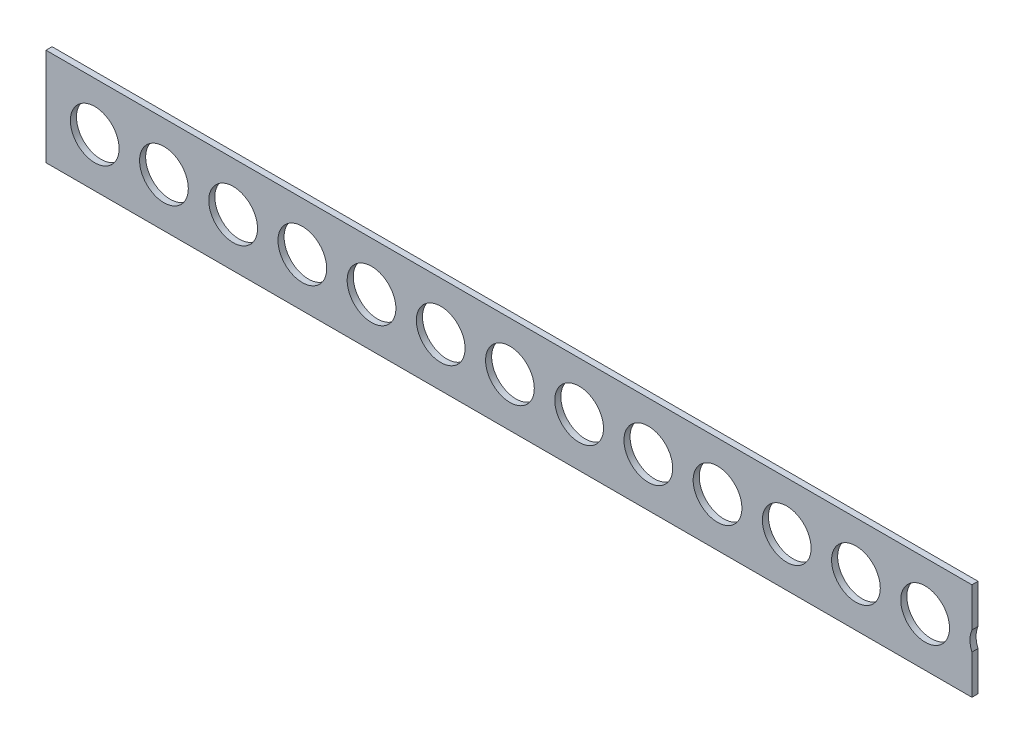
ISO-10303-21;
HEADER;
FILE_DESCRIPTION(('STEP AP214'),'2;1');
FILE_NAME('part.step','',(''),(''),'','','');
FILE_SCHEMA(('AUTOMOTIVE_DESIGN { 1 0 10303 214 1 1 1 1 }'));
ENDSEC;
DATA;
#1=APPLICATION_CONTEXT('core data for automotive mechanical design processes');
#2=APPLICATION_PROTOCOL_DEFINITION('international standard','automotive_design',2000,#1);
#3=PRODUCT_CONTEXT('',#1,'mechanical');
#4=PRODUCT('Part','Part','',(#3));
#5=PRODUCT_RELATED_PRODUCT_CATEGORY('part','',(#4));
#6=PRODUCT_DEFINITION_FORMATION('','',#4);
#7=PRODUCT_DEFINITION_CONTEXT('part definition',#1,'design');
#8=PRODUCT_DEFINITION('design','',#6,#7);
#9=PRODUCT_DEFINITION_SHAPE('','',#8);
#10=(LENGTH_UNIT() NAMED_UNIT(*) SI_UNIT(.MILLI.,.METRE.));
#11=(NAMED_UNIT(*) PLANE_ANGLE_UNIT() SI_UNIT($,.RADIAN.));
#12=(NAMED_UNIT(*) SI_UNIT($,.STERADIAN.) SOLID_ANGLE_UNIT());
#13=UNCERTAINTY_MEASURE_WITH_UNIT(LENGTH_MEASURE(1.E-05),#10,'distance_accuracy_value','');
#14=(GEOMETRIC_REPRESENTATION_CONTEXT(3) GLOBAL_UNCERTAINTY_ASSIGNED_CONTEXT((#13)) GLOBAL_UNIT_ASSIGNED_CONTEXT((#10,
#11,#12)) REPRESENTATION_CONTEXT('',''));
#15=CARTESIAN_POINT('',(0.,0.,0.));
#16=DIRECTION('',(0.,0.,1.));
#17=DIRECTION('',(1.,0.,0.));
#18=AXIS2_PLACEMENT_3D('',#15,#16,#17);
#19=CARTESIAN_POINT('',(482.6,50.8,3.175));
#20=DIRECTION('',(-1.,0.,0.));
#21=DIRECTION('',(0.,0.,1.));
#22=AXIS2_PLACEMENT_3D('',#19,#20,#21);
#23=PLANE('',#22);
#24=DIRECTION('',(0.,1.,0.));
#25=VECTOR('',#24,1.);
#26=CARTESIAN_POINT('',(482.6,50.8,0.));
#27=LINE('',#26,#25);
#28=CARTESIAN_POINT('',(482.6,0.,0.));
#29=VERTEX_POINT('',#28);
#30=CARTESIAN_POINT('',(482.6,20.4226368426645,0.));
#31=VERTEX_POINT('',#30);
#32=EDGE_CURVE('E115',#29,#31,#27,.T.);
#33=ORIENTED_EDGE('',*,*,#32,.T.);
#34=DIRECTION('',(0.,0.,1.));
#35=VECTOR('',#34,1.);
#36=CARTESIAN_POINT('',(482.6,20.4226368426645,0.));
#37=LINE('',#36,#35);
#38=CARTESIAN_POINT('',(482.6,20.4226368426645,3.175));
#39=VERTEX_POINT('',#38);
#40=EDGE_CURVE('E48',#31,#39,#37,.T.);
#41=ORIENTED_EDGE('',*,*,#40,.T.);
#42=DIRECTION('',(0.,1.,0.));
#43=VECTOR('',#42,1.);
#44=CARTESIAN_POINT('',(482.6,50.8,3.175));
#45=LINE('',#44,#43);
#46=CARTESIAN_POINT('',(482.6,0.,3.175));
#47=VERTEX_POINT('',#46);
#48=EDGE_CURVE('E85',#47,#39,#45,.T.);
#49=ORIENTED_EDGE('',*,*,#48,.F.);
#50=DIRECTION('',(0.,0.,-1.));
#51=VECTOR('',#50,1.);
#52=CARTESIAN_POINT('',(482.6,0.,3.175));
#53=LINE('',#52,#51);
#54=EDGE_CURVE('E132',#47,#29,#53,.T.);
#55=ORIENTED_EDGE('',*,*,#54,.T.);
#56=EDGE_LOOP('',(#33,#41,#49,#55));
#57=FACE_BOUND('',#56,.T.);
#58=ADVANCED_FACE('F33',(#57),#23,.F.);
#59=CARTESIAN_POINT('',(458.216,25.4,0.));
#60=DIRECTION('',(0.,0.,1.));
#61=DIRECTION('',(1.,0.,0.));
#62=AXIS2_PLACEMENT_3D('',#59,#60,#61);
#63=CYLINDRICAL_SURFACE('',#62,12.7);
#64=CARTESIAN_POINT('',(458.216,25.4,0.));
#65=DIRECTION('',(0.,0.,1.));
#66=DIRECTION('',(1.,0.,0.));
#67=AXIS2_PLACEMENT_3D('',#64,#65,#66);
#68=CIRCLE('',#67,12.7);
#69=CARTESIAN_POINT('',(470.916,25.4,0.));
#70=VERTEX_POINT('',#69);
#71=EDGE_CURVE('E41',#70,#70,#68,.T.);
#72=ORIENTED_EDGE('',*,*,#71,.F.);
#73=EDGE_LOOP('',(#72));
#74=FACE_BOUND('',#73,.T.);
#75=CARTESIAN_POINT('',(458.216,25.4,3.175));
#76=DIRECTION('',(0.,0.,1.));
#77=DIRECTION('',(1.,0.,0.));
#78=AXIS2_PLACEMENT_3D('',#75,#76,#77);
#79=CIRCLE('',#78,12.7);
#80=CARTESIAN_POINT('',(470.916,25.4,3.175));
#81=VERTEX_POINT('',#80);
#82=EDGE_CURVE('E11',#81,#81,#79,.T.);
#83=ORIENTED_EDGE('',*,*,#82,.T.);
#84=EDGE_LOOP('',(#83));
#85=FACE_BOUND('',#84,.T.);
#86=ADVANCED_FACE('F35',(#74,#85),#63,.F.);
#87=CARTESIAN_POINT('',(422.148,25.4,0.));
#88=DIRECTION('',(0.,0.,1.));
#89=DIRECTION('',(1.,0.,0.));
#90=AXIS2_PLACEMENT_3D('',#87,#88,#89);
#91=CYLINDRICAL_SURFACE('',#90,12.7);
#92=CARTESIAN_POINT('',(422.148,25.4,0.));
#93=DIRECTION('',(0.,0.,1.));
#94=DIRECTION('',(1.,0.,0.));
#95=AXIS2_PLACEMENT_3D('',#92,#93,#94);
#96=CIRCLE('',#95,12.7);
#97=CARTESIAN_POINT('',(434.848,25.4,0.));
#98=VERTEX_POINT('',#97);
#99=EDGE_CURVE('E188',#98,#98,#96,.T.);
#100=ORIENTED_EDGE('',*,*,#99,.F.);
#101=EDGE_LOOP('',(#100));
#102=FACE_BOUND('',#101,.T.);
#103=CARTESIAN_POINT('',(422.148,25.4,3.175));
#104=DIRECTION('',(0.,0.,1.));
#105=DIRECTION('',(1.,0.,0.));
#106=AXIS2_PLACEMENT_3D('',#103,#104,#105);
#107=CIRCLE('',#106,12.7);
#108=CARTESIAN_POINT('',(434.848,25.4,3.175));
#109=VERTEX_POINT('',#108);
#110=EDGE_CURVE('E191',#109,#109,#107,.T.);
#111=ORIENTED_EDGE('',*,*,#110,.T.);
#112=EDGE_LOOP('',(#111));
#113=FACE_BOUND('',#112,.T.);
#114=ADVANCED_FACE('F199',(#102,#113),#91,.F.);
#115=CARTESIAN_POINT('',(386.08,25.4,0.));
#116=DIRECTION('',(0.,0.,1.));
#117=DIRECTION('',(1.,0.,0.));
#118=AXIS2_PLACEMENT_3D('',#115,#116,#117);
#119=CYLINDRICAL_SURFACE('',#118,12.7);
#120=CARTESIAN_POINT('',(386.08,25.4,0.));
#121=DIRECTION('',(0.,0.,1.));
#122=DIRECTION('',(1.,0.,0.));
#123=AXIS2_PLACEMENT_3D('',#120,#121,#122);
#124=CIRCLE('',#123,12.7);
#125=CARTESIAN_POINT('',(398.78,25.4,0.));
#126=VERTEX_POINT('',#125);
#127=EDGE_CURVE('E182',#126,#126,#124,.T.);
#128=ORIENTED_EDGE('',*,*,#127,.F.);
#129=EDGE_LOOP('',(#128));
#130=FACE_BOUND('',#129,.T.);
#131=CARTESIAN_POINT('',(386.08,25.4,3.175));
#132=DIRECTION('',(0.,0.,1.));
#133=DIRECTION('',(1.,0.,0.));
#134=AXIS2_PLACEMENT_3D('',#131,#132,#133);
#135=CIRCLE('',#134,12.7);
#136=CARTESIAN_POINT('',(398.78,25.4,3.175));
#137=VERTEX_POINT('',#136);
#138=EDGE_CURVE('E185',#137,#137,#135,.T.);
#139=ORIENTED_EDGE('',*,*,#138,.T.);
#140=EDGE_LOOP('',(#139));
#141=FACE_BOUND('',#140,.T.);
#142=ADVANCED_FACE('F266',(#130,#141),#119,.F.);
#143=CARTESIAN_POINT('',(350.012,25.4,0.));
#144=DIRECTION('',(0.,0.,1.));
#145=DIRECTION('',(1.,0.,0.));
#146=AXIS2_PLACEMENT_3D('',#143,#144,#145);
#147=CYLINDRICAL_SURFACE('',#146,12.7);
#148=CARTESIAN_POINT('',(350.012,25.4,0.));
#149=DIRECTION('',(0.,0.,1.));
#150=DIRECTION('',(1.,0.,0.));
#151=AXIS2_PLACEMENT_3D('',#148,#149,#150);
#152=CIRCLE('',#151,12.7);
#153=CARTESIAN_POINT('',(362.712,25.4,0.));
#154=VERTEX_POINT('',#153);
#155=EDGE_CURVE('E176',#154,#154,#152,.T.);
#156=ORIENTED_EDGE('',*,*,#155,.F.);
#157=EDGE_LOOP('',(#156));
#158=FACE_BOUND('',#157,.T.);
#159=CARTESIAN_POINT('',(350.012,25.4,3.175));
#160=DIRECTION('',(0.,0.,1.));
#161=DIRECTION('',(1.,0.,0.));
#162=AXIS2_PLACEMENT_3D('',#159,#160,#161);
#163=CIRCLE('',#162,12.7);
#164=CARTESIAN_POINT('',(362.712,25.4,3.175));
#165=VERTEX_POINT('',#164);
#166=EDGE_CURVE('E179',#165,#165,#163,.T.);
#167=ORIENTED_EDGE('',*,*,#166,.T.);
#168=EDGE_LOOP('',(#167));
#169=FACE_BOUND('',#168,.T.);
#170=ADVANCED_FACE('F262',(#158,#169),#147,.F.);
#171=CARTESIAN_POINT('',(313.944,25.4,0.));
#172=DIRECTION('',(0.,0.,1.));
#173=DIRECTION('',(1.,0.,0.));
#174=AXIS2_PLACEMENT_3D('',#171,#172,#173);
#175=CYLINDRICAL_SURFACE('',#174,12.7);
#176=CARTESIAN_POINT('',(313.944,25.4,0.));
#177=DIRECTION('',(0.,0.,1.));
#178=DIRECTION('',(1.,0.,0.));
#179=AXIS2_PLACEMENT_3D('',#176,#177,#178);
#180=CIRCLE('',#179,12.7);
#181=CARTESIAN_POINT('',(326.644,25.4,0.));
#182=VERTEX_POINT('',#181);
#183=EDGE_CURVE('E170',#182,#182,#180,.T.);
#184=ORIENTED_EDGE('',*,*,#183,.F.);
#185=EDGE_LOOP('',(#184));
#186=FACE_BOUND('',#185,.T.);
#187=CARTESIAN_POINT('',(313.944,25.4,3.175));
#188=DIRECTION('',(0.,0.,1.));
#189=DIRECTION('',(1.,0.,0.));
#190=AXIS2_PLACEMENT_3D('',#187,#188,#189);
#191=CIRCLE('',#190,12.7);
#192=CARTESIAN_POINT('',(326.644,25.4,3.175));
#193=VERTEX_POINT('',#192);
#194=EDGE_CURVE('E173',#193,#193,#191,.T.);
#195=ORIENTED_EDGE('',*,*,#194,.T.);
#196=EDGE_LOOP('',(#195));
#197=FACE_BOUND('',#196,.T.);
#198=ADVANCED_FACE('F258',(#186,#197),#175,.F.);
#199=CARTESIAN_POINT('',(277.876,25.4,0.));
#200=DIRECTION('',(0.,0.,1.));
#201=DIRECTION('',(1.,0.,0.));
#202=AXIS2_PLACEMENT_3D('',#199,#200,#201);
#203=CYLINDRICAL_SURFACE('',#202,12.7);
#204=CARTESIAN_POINT('',(277.876,25.4,0.));
#205=DIRECTION('',(0.,0.,1.));
#206=DIRECTION('',(1.,0.,0.));
#207=AXIS2_PLACEMENT_3D('',#204,#205,#206);
#208=CIRCLE('',#207,12.7);
#209=CARTESIAN_POINT('',(290.576,25.4,0.));
#210=VERTEX_POINT('',#209);
#211=EDGE_CURVE('E164',#210,#210,#208,.T.);
#212=ORIENTED_EDGE('',*,*,#211,.F.);
#213=EDGE_LOOP('',(#212));
#214=FACE_BOUND('',#213,.T.);
#215=CARTESIAN_POINT('',(277.876,25.4,3.175));
#216=DIRECTION('',(0.,0.,1.));
#217=DIRECTION('',(1.,0.,0.));
#218=AXIS2_PLACEMENT_3D('',#215,#216,#217);
#219=CIRCLE('',#218,12.7);
#220=CARTESIAN_POINT('',(290.576,25.4,3.175));
#221=VERTEX_POINT('',#220);
#222=EDGE_CURVE('E167',#221,#221,#219,.T.);
#223=ORIENTED_EDGE('',*,*,#222,.T.);
#224=EDGE_LOOP('',(#223));
#225=FACE_BOUND('',#224,.T.);
#226=ADVANCED_FACE('F254',(#214,#225),#203,.F.);
#227=CARTESIAN_POINT('',(241.808,25.4,0.));
#228=DIRECTION('',(0.,0.,1.));
#229=DIRECTION('',(1.,0.,0.));
#230=AXIS2_PLACEMENT_3D('',#227,#228,#229);
#231=CYLINDRICAL_SURFACE('',#230,12.7);
#232=CARTESIAN_POINT('',(241.808,25.4,0.));
#233=DIRECTION('',(0.,0.,1.));
#234=DIRECTION('',(1.,0.,0.));
#235=AXIS2_PLACEMENT_3D('',#232,#233,#234);
#236=CIRCLE('',#235,12.7);
#237=CARTESIAN_POINT('',(254.508,25.4,0.));
#238=VERTEX_POINT('',#237);
#239=EDGE_CURVE('E158',#238,#238,#236,.T.);
#240=ORIENTED_EDGE('',*,*,#239,.F.);
#241=EDGE_LOOP('',(#240));
#242=FACE_BOUND('',#241,.T.);
#243=CARTESIAN_POINT('',(241.808,25.4,3.175));
#244=DIRECTION('',(0.,0.,1.));
#245=DIRECTION('',(1.,0.,0.));
#246=AXIS2_PLACEMENT_3D('',#243,#244,#245);
#247=CIRCLE('',#246,12.7);
#248=CARTESIAN_POINT('',(254.508,25.4,3.175));
#249=VERTEX_POINT('',#248);
#250=EDGE_CURVE('E161',#249,#249,#247,.T.);
#251=ORIENTED_EDGE('',*,*,#250,.T.);
#252=EDGE_LOOP('',(#251));
#253=FACE_BOUND('',#252,.T.);
#254=ADVANCED_FACE('F250',(#242,#253),#231,.F.);
#255=CARTESIAN_POINT('',(205.74,25.4,0.));
#256=DIRECTION('',(0.,0.,1.));
#257=DIRECTION('',(1.,0.,0.));
#258=AXIS2_PLACEMENT_3D('',#255,#256,#257);
#259=CYLINDRICAL_SURFACE('',#258,12.7);
#260=CARTESIAN_POINT('',(205.74,25.4,0.));
#261=DIRECTION('',(0.,0.,1.));
#262=DIRECTION('',(1.,0.,0.));
#263=AXIS2_PLACEMENT_3D('',#260,#261,#262);
#264=CIRCLE('',#263,12.7);
#265=CARTESIAN_POINT('',(218.44,25.4,0.));
#266=VERTEX_POINT('',#265);
#267=EDGE_CURVE('E152',#266,#266,#264,.T.);
#268=ORIENTED_EDGE('',*,*,#267,.F.);
#269=EDGE_LOOP('',(#268));
#270=FACE_BOUND('',#269,.T.);
#271=CARTESIAN_POINT('',(205.74,25.4,3.175));
#272=DIRECTION('',(0.,0.,1.));
#273=DIRECTION('',(1.,0.,0.));
#274=AXIS2_PLACEMENT_3D('',#271,#272,#273);
#275=CIRCLE('',#274,12.7);
#276=CARTESIAN_POINT('',(218.44,25.4,3.175));
#277=VERTEX_POINT('',#276);
#278=EDGE_CURVE('E155',#277,#277,#275,.T.);
#279=ORIENTED_EDGE('',*,*,#278,.T.);
#280=EDGE_LOOP('',(#279));
#281=FACE_BOUND('',#280,.T.);
#282=ADVANCED_FACE('F246',(#270,#281),#259,.F.);
#283=CARTESIAN_POINT('',(169.672,25.4,0.));
#284=DIRECTION('',(0.,0.,1.));
#285=DIRECTION('',(1.,0.,0.));
#286=AXIS2_PLACEMENT_3D('',#283,#284,#285);
#287=CYLINDRICAL_SURFACE('',#286,12.7);
#288=CARTESIAN_POINT('',(169.672,25.4,0.));
#289=DIRECTION('',(0.,0.,1.));
#290=DIRECTION('',(1.,0.,0.));
#291=AXIS2_PLACEMENT_3D('',#288,#289,#290);
#292=CIRCLE('',#291,12.7);
#293=CARTESIAN_POINT('',(182.372,25.4,0.));
#294=VERTEX_POINT('',#293);
#295=EDGE_CURVE('E146',#294,#294,#292,.T.);
#296=ORIENTED_EDGE('',*,*,#295,.F.);
#297=EDGE_LOOP('',(#296));
#298=FACE_BOUND('',#297,.T.);
#299=CARTESIAN_POINT('',(169.672,25.4,3.175));
#300=DIRECTION('',(0.,0.,1.));
#301=DIRECTION('',(1.,0.,0.));
#302=AXIS2_PLACEMENT_3D('',#299,#300,#301);
#303=CIRCLE('',#302,12.7);
#304=CARTESIAN_POINT('',(182.372,25.4,3.175));
#305=VERTEX_POINT('',#304);
#306=EDGE_CURVE('E149',#305,#305,#303,.T.);
#307=ORIENTED_EDGE('',*,*,#306,.T.);
#308=EDGE_LOOP('',(#307));
#309=FACE_BOUND('',#308,.T.);
#310=ADVANCED_FACE('F242',(#298,#309),#287,.F.);
#311=CARTESIAN_POINT('',(133.604,25.4,0.));
#312=DIRECTION('',(0.,0.,1.));
#313=DIRECTION('',(1.,0.,0.));
#314=AXIS2_PLACEMENT_3D('',#311,#312,#313);
#315=CYLINDRICAL_SURFACE('',#314,12.7);
#316=CARTESIAN_POINT('',(133.604,25.4,0.));
#317=DIRECTION('',(0.,0.,1.));
#318=DIRECTION('',(1.,0.,0.));
#319=AXIS2_PLACEMENT_3D('',#316,#317,#318);
#320=CIRCLE('',#319,12.7);
#321=CARTESIAN_POINT('',(146.304,25.4,0.));
#322=VERTEX_POINT('',#321);
#323=EDGE_CURVE('E140',#322,#322,#320,.T.);
#324=ORIENTED_EDGE('',*,*,#323,.F.);
#325=EDGE_LOOP('',(#324));
#326=FACE_BOUND('',#325,.T.);
#327=CARTESIAN_POINT('',(133.604,25.4,3.175));
#328=DIRECTION('',(0.,0.,1.));
#329=DIRECTION('',(1.,0.,0.));
#330=AXIS2_PLACEMENT_3D('',#327,#328,#329);
#331=CIRCLE('',#330,12.7);
#332=CARTESIAN_POINT('',(146.304,25.4,3.175));
#333=VERTEX_POINT('',#332);
#334=EDGE_CURVE('E143',#333,#333,#331,.T.);
#335=ORIENTED_EDGE('',*,*,#334,.T.);
#336=EDGE_LOOP('',(#335));
#337=FACE_BOUND('',#336,.T.);
#338=ADVANCED_FACE('F236',(#326,#337),#315,.F.);
#339=CARTESIAN_POINT('',(97.536,25.4,0.));
#340=DIRECTION('',(0.,0.,1.));
#341=DIRECTION('',(1.,0.,0.));
#342=AXIS2_PLACEMENT_3D('',#339,#340,#341);
#343=CYLINDRICAL_SURFACE('',#342,12.7);
#344=CARTESIAN_POINT('',(97.536,25.4,0.));
#345=DIRECTION('',(0.,0.,1.));
#346=DIRECTION('',(1.,0.,0.));
#347=AXIS2_PLACEMENT_3D('',#344,#345,#346);
#348=CIRCLE('',#347,12.7);
#349=CARTESIAN_POINT('',(110.236,25.4,0.));
#350=VERTEX_POINT('',#349);
#351=EDGE_CURVE('E134',#350,#350,#348,.T.);
#352=ORIENTED_EDGE('',*,*,#351,.F.);
#353=EDGE_LOOP('',(#352));
#354=FACE_BOUND('',#353,.T.);
#355=CARTESIAN_POINT('',(97.536,25.4,3.175));
#356=DIRECTION('',(0.,0.,1.));
#357=DIRECTION('',(1.,0.,0.));
#358=AXIS2_PLACEMENT_3D('',#355,#356,#357);
#359=CIRCLE('',#358,12.7);
#360=CARTESIAN_POINT('',(110.236,25.4,3.175));
#361=VERTEX_POINT('',#360);
#362=EDGE_CURVE('E137',#361,#361,#359,.T.);
#363=ORIENTED_EDGE('',*,*,#362,.T.);
#364=EDGE_LOOP('',(#363));
#365=FACE_BOUND('',#364,.T.);
#366=ADVANCED_FACE('F231',(#354,#365),#343,.F.);
#367=CARTESIAN_POINT('',(482.6,0.,3.175));
#368=DIRECTION('',(0.,1.,0.));
#369=DIRECTION('',(-1.,0.,0.));
#370=AXIS2_PLACEMENT_3D('',#367,#368,#369);
#371=PLANE('',#370);
#372=DIRECTION('',(1.,0.,0.));
#373=VECTOR('',#372,1.);
#374=CARTESIAN_POINT('',(482.6,0.,0.));
#375=LINE('',#374,#373);
#376=CARTESIAN_POINT('',(0.,0.,0.));
#377=VERTEX_POINT('',#376);
#378=EDGE_CURVE('E116',#377,#29,#375,.T.);
#379=ORIENTED_EDGE('',*,*,#378,.T.);
#380=ORIENTED_EDGE('',*,*,#54,.F.);
#381=DIRECTION('',(1.,0.,0.));
#382=VECTOR('',#381,1.);
#383=CARTESIAN_POINT('',(482.6,0.,3.175));
#384=LINE('',#383,#382);
#385=CARTESIAN_POINT('',(0.,0.,3.175));
#386=VERTEX_POINT('',#385);
#387=EDGE_CURVE('E125',#386,#47,#384,.T.);
#388=ORIENTED_EDGE('',*,*,#387,.F.);
#389=DIRECTION('',(0.,0.,-1.));
#390=VECTOR('',#389,1.);
#391=CARTESIAN_POINT('',(0.,0.,3.175));
#392=LINE('',#391,#390);
#393=EDGE_CURVE('E126',#386,#377,#392,.T.);
#394=ORIENTED_EDGE('',*,*,#393,.T.);
#395=EDGE_LOOP('',(#379,#380,#388,#394));
#396=FACE_BOUND('',#395,.T.);
#397=ADVANCED_FACE('F225',(#396),#371,.F.);
#398=CARTESIAN_POINT('',(482.6,30.3773631573355,3.175));
#399=VERTEX_POINT('',#398);
#400=CARTESIAN_POINT('',(482.6,50.8,3.175));
#401=VERTEX_POINT('',#400);
#402=EDGE_CURVE('E109',#399,#401,#45,.T.);
#403=ORIENTED_EDGE('',*,*,#402,.F.);
#404=DIRECTION('',(0.,0.,1.));
#405=VECTOR('',#404,1.);
#406=CARTESIAN_POINT('',(482.6,30.3773631573355,0.));
#407=LINE('',#406,#405);
#408=CARTESIAN_POINT('',(482.6,30.3773631573355,0.));
#409=VERTEX_POINT('',#408);
#410=EDGE_CURVE('E96',#399,#409,#407,.F.);
#411=ORIENTED_EDGE('',*,*,#410,.T.);
#412=CARTESIAN_POINT('',(482.6,50.8,0.));
#413=VERTEX_POINT('',#412);
#414=EDGE_CURVE('E107',#409,#413,#27,.T.);
#415=ORIENTED_EDGE('',*,*,#414,.T.);
#416=DIRECTION('',(0.,0.,-1.));
#417=VECTOR('',#416,1.);
#418=CARTESIAN_POINT('',(482.6,50.8,3.175));
#419=LINE('',#418,#417);
#420=EDGE_CURVE('E130',#401,#413,#419,.T.);
#421=ORIENTED_EDGE('',*,*,#420,.F.);
#422=EDGE_LOOP('',(#403,#411,#415,#421));
#423=FACE_BOUND('',#422,.T.);
#424=ADVANCED_FACE('F105',(#423),#23,.F.);
#425=CARTESIAN_POINT('',(0.,50.8,3.175));
#426=DIRECTION('',(0.,-1.,0.));
#427=DIRECTION('',(0.,0.,-1.));
#428=AXIS2_PLACEMENT_3D('',#425,#426,#427);
#429=PLANE('',#428);
#430=DIRECTION('',(-1.,0.,0.));
#431=VECTOR('',#430,1.);
#432=CARTESIAN_POINT('',(0.,50.8,0.));
#433=LINE('',#432,#431);
#434=CARTESIAN_POINT('',(0.,50.8,0.));
#435=VERTEX_POINT('',#434);
#436=EDGE_CURVE('E114',#413,#435,#433,.T.);
#437=ORIENTED_EDGE('',*,*,#436,.T.);
#438=DIRECTION('',(0.,0.,-1.));
#439=VECTOR('',#438,1.);
#440=CARTESIAN_POINT('',(0.,50.8,3.175));
#441=LINE('',#440,#439);
#442=CARTESIAN_POINT('',(0.,50.8,3.175));
#443=VERTEX_POINT('',#442);
#444=EDGE_CURVE('E128',#443,#435,#441,.T.);
#445=ORIENTED_EDGE('',*,*,#444,.F.);
#446=DIRECTION('',(-1.,0.,0.));
#447=VECTOR('',#446,1.);
#448=CARTESIAN_POINT('',(0.,50.8,3.175));
#449=LINE('',#448,#447);
#450=EDGE_CURVE('E376',#401,#443,#449,.T.);
#451=ORIENTED_EDGE('',*,*,#450,.F.);
#452=ORIENTED_EDGE('',*,*,#420,.T.);
#453=EDGE_LOOP('',(#437,#445,#451,#452));
#454=FACE_BOUND('',#453,.T.);
#455=ADVANCED_FACE('F213',(#454),#429,.F.);
#456=CARTESIAN_POINT('',(0.,0.,3.175));
#457=DIRECTION('',(1.,0.,0.));
#458=DIRECTION('',(0.,0.,-1.));
#459=AXIS2_PLACEMENT_3D('',#456,#457,#458);
#460=PLANE('',#459);
#461=DIRECTION('',(0.,-1.,0.));
#462=VECTOR('',#461,1.);
#463=CARTESIAN_POINT('',(0.,0.,0.));
#464=LINE('',#463,#462);
#465=EDGE_CURVE('E78',#435,#377,#464,.T.);
#466=ORIENTED_EDGE('',*,*,#465,.T.);
#467=ORIENTED_EDGE('',*,*,#393,.F.);
#468=DIRECTION('',(0.,-1.,0.));
#469=VECTOR('',#468,1.);
#470=CARTESIAN_POINT('',(0.,0.,3.175));
#471=LINE('',#470,#469);
#472=EDGE_CURVE('E57',#443,#386,#471,.T.);
#473=ORIENTED_EDGE('',*,*,#472,.F.);
#474=ORIENTED_EDGE('',*,*,#444,.T.);
#475=EDGE_LOOP('',(#466,#467,#473,#474));
#476=FACE_BOUND('',#475,.T.);
#477=ADVANCED_FACE('F204',(#476),#460,.F.);
#478=CARTESIAN_POINT('',(0.,0.,3.175));
#479=DIRECTION('',(0.,0.,-1.));
#480=DIRECTION('',(-1.,0.,0.));
#481=AXIS2_PLACEMENT_3D('',#478,#479,#480);
#482=PLANE('',#481);
#483=CARTESIAN_POINT('',(61.468,25.4,3.175));
#484=DIRECTION('',(0.,0.,1.));
#485=DIRECTION('',(1.,0.,0.));
#486=AXIS2_PLACEMENT_3D('',#483,#484,#485);
#487=CIRCLE('',#486,12.7);
#488=CARTESIAN_POINT('',(74.168,25.4,3.175));
#489=VERTEX_POINT('',#488);
#490=EDGE_CURVE('E367',#489,#489,#487,.T.);
#491=ORIENTED_EDGE('',*,*,#490,.F.);
#492=EDGE_LOOP('',(#491));
#493=FACE_BOUND('',#492,.T.);
#494=CARTESIAN_POINT('',(25.4,25.4,3.175));
#495=DIRECTION('',(0.,0.,1.));
#496=DIRECTION('',(1.,0.,0.));
#497=AXIS2_PLACEMENT_3D('',#494,#495,#496);
#498=CIRCLE('',#497,12.7);
#499=CARTESIAN_POINT('',(38.1,25.4,3.175));
#500=VERTEX_POINT('',#499);
#501=EDGE_CURVE('E366',#500,#500,#498,.T.);
#502=ORIENTED_EDGE('',*,*,#501,.F.);
#503=EDGE_LOOP('',(#502));
#504=FACE_BOUND('',#503,.T.);
#505=ORIENTED_EDGE('',*,*,#48,.T.);
#506=CARTESIAN_POINT('',(494.284,25.4,3.175));
#507=DIRECTION('',(0.,0.,1.));
#508=DIRECTION('',(1.,0.,0.));
#509=AXIS2_PLACEMENT_3D('',#506,#507,#508);
#510=CIRCLE('',#509,12.7);
#511=EDGE_CURVE('E101',#399,#39,#510,.T.);
#512=ORIENTED_EDGE('',*,*,#511,.F.);
#513=ORIENTED_EDGE('',*,*,#402,.T.);
#514=ORIENTED_EDGE('',*,*,#450,.T.);
#515=ORIENTED_EDGE('',*,*,#472,.T.);
#516=ORIENTED_EDGE('',*,*,#387,.T.);
#517=EDGE_LOOP('',(#505,#512,#513,#514,#515,#516));
#518=FACE_BOUND('',#517,.T.);
#519=ORIENTED_EDGE('',*,*,#362,.F.);
#520=EDGE_LOOP('',(#519));
#521=FACE_BOUND('',#520,.T.);
#522=ORIENTED_EDGE('',*,*,#334,.F.);
#523=EDGE_LOOP('',(#522));
#524=FACE_BOUND('',#523,.T.);
#525=ORIENTED_EDGE('',*,*,#306,.F.);
#526=EDGE_LOOP('',(#525));
#527=FACE_BOUND('',#526,.T.);
#528=ORIENTED_EDGE('',*,*,#278,.F.);
#529=EDGE_LOOP('',(#528));
#530=FACE_BOUND('',#529,.T.);
#531=ORIENTED_EDGE('',*,*,#250,.F.);
#532=EDGE_LOOP('',(#531));
#533=FACE_BOUND('',#532,.T.);
#534=ORIENTED_EDGE('',*,*,#222,.F.);
#535=EDGE_LOOP('',(#534));
#536=FACE_BOUND('',#535,.T.);
#537=ORIENTED_EDGE('',*,*,#194,.F.);
#538=EDGE_LOOP('',(#537));
#539=FACE_BOUND('',#538,.T.);
#540=ORIENTED_EDGE('',*,*,#166,.F.);
#541=EDGE_LOOP('',(#540));
#542=FACE_BOUND('',#541,.T.);
#543=ORIENTED_EDGE('',*,*,#138,.F.);
#544=EDGE_LOOP('',(#543));
#545=FACE_BOUND('',#544,.T.);
#546=ORIENTED_EDGE('',*,*,#110,.F.);
#547=EDGE_LOOP('',(#546));
#548=FACE_BOUND('',#547,.T.);
#549=ORIENTED_EDGE('',*,*,#82,.F.);
#550=EDGE_LOOP('',(#549));
#551=FACE_BOUND('',#550,.T.);
#552=ADVANCED_FACE('F202',(#493,#504,#518,#521,#524,#527,#530,#533,#536,#539,#542,#545,#548,
#551),#482,.F.);
#553=CARTESIAN_POINT('',(0.,0.,0.));
#554=DIRECTION('',(0.,0.,-1.));
#555=DIRECTION('',(-1.,0.,0.));
#556=AXIS2_PLACEMENT_3D('',#553,#554,#555);
#557=PLANE('',#556);
#558=CARTESIAN_POINT('',(494.284,25.4,0.));
#559=DIRECTION('',(0.,0.,1.));
#560=DIRECTION('',(1.,0.,0.));
#561=AXIS2_PLACEMENT_3D('',#558,#559,#560);
#562=CIRCLE('',#561,12.7);
#563=EDGE_CURVE('E93',#409,#31,#562,.T.);
#564=ORIENTED_EDGE('',*,*,#563,.T.);
#565=ORIENTED_EDGE('',*,*,#32,.F.);
#566=ORIENTED_EDGE('',*,*,#378,.F.);
#567=ORIENTED_EDGE('',*,*,#465,.F.);
#568=ORIENTED_EDGE('',*,*,#436,.F.);
#569=ORIENTED_EDGE('',*,*,#414,.F.);
#570=EDGE_LOOP('',(#564,#565,#566,#567,#568,#569));
#571=FACE_BOUND('',#570,.T.);
#572=CARTESIAN_POINT('',(61.468,25.4,0.));
#573=DIRECTION('',(0.,0.,1.));
#574=DIRECTION('',(1.,0.,0.));
#575=AXIS2_PLACEMENT_3D('',#572,#573,#574);
#576=CIRCLE('',#575,12.7);
#577=CARTESIAN_POINT('',(74.168,25.4,0.));
#578=VERTEX_POINT('',#577);
#579=EDGE_CURVE('E371',#578,#578,#576,.T.);
#580=ORIENTED_EDGE('',*,*,#579,.T.);
#581=EDGE_LOOP('',(#580));
#582=FACE_BOUND('',#581,.T.);
#583=CARTESIAN_POINT('',(25.4,25.4,0.));
#584=DIRECTION('',(0.,0.,1.));
#585=DIRECTION('',(1.,0.,0.));
#586=AXIS2_PLACEMENT_3D('',#583,#584,#585);
#587=CIRCLE('',#586,12.7);
#588=CARTESIAN_POINT('',(38.1,25.4,0.));
#589=VERTEX_POINT('',#588);
#590=EDGE_CURVE('E119',#589,#589,#587,.T.);
#591=ORIENTED_EDGE('',*,*,#590,.T.);
#592=EDGE_LOOP('',(#591));
#593=FACE_BOUND('',#592,.T.);
#594=ORIENTED_EDGE('',*,*,#351,.T.);
#595=EDGE_LOOP('',(#594));
#596=FACE_BOUND('',#595,.T.);
#597=ORIENTED_EDGE('',*,*,#323,.T.);
#598=EDGE_LOOP('',(#597));
#599=FACE_BOUND('',#598,.T.);
#600=ORIENTED_EDGE('',*,*,#295,.T.);
#601=EDGE_LOOP('',(#600));
#602=FACE_BOUND('',#601,.T.);
#603=ORIENTED_EDGE('',*,*,#267,.T.);
#604=EDGE_LOOP('',(#603));
#605=FACE_BOUND('',#604,.T.);
#606=ORIENTED_EDGE('',*,*,#239,.T.);
#607=EDGE_LOOP('',(#606));
#608=FACE_BOUND('',#607,.T.);
#609=ORIENTED_EDGE('',*,*,#211,.T.);
#610=EDGE_LOOP('',(#609));
#611=FACE_BOUND('',#610,.T.);
#612=ORIENTED_EDGE('',*,*,#183,.T.);
#613=EDGE_LOOP('',(#612));
#614=FACE_BOUND('',#613,.T.);
#615=ORIENTED_EDGE('',*,*,#155,.T.);
#616=EDGE_LOOP('',(#615));
#617=FACE_BOUND('',#616,.T.);
#618=ORIENTED_EDGE('',*,*,#127,.T.);
#619=EDGE_LOOP('',(#618));
#620=FACE_BOUND('',#619,.T.);
#621=ORIENTED_EDGE('',*,*,#99,.T.);
#622=EDGE_LOOP('',(#621));
#623=FACE_BOUND('',#622,.T.);
#624=ORIENTED_EDGE('',*,*,#71,.T.);
#625=EDGE_LOOP('',(#624));
#626=FACE_BOUND('',#625,.T.);
#627=ADVANCED_FACE('F112',(#571,#582,#593,#596,#599,#602,#605,#608,#611,#614,#617,#620,#623,
#626),#557,.T.);
#628=CARTESIAN_POINT('',(25.4,25.4,0.));
#629=DIRECTION('',(0.,0.,1.));
#630=DIRECTION('',(1.,0.,0.));
#631=AXIS2_PLACEMENT_3D('',#628,#629,#630);
#632=CYLINDRICAL_SURFACE('',#631,12.7);
#633=ORIENTED_EDGE('',*,*,#590,.F.);
#634=EDGE_LOOP('',(#633));
#635=FACE_BOUND('',#634,.T.);
#636=ORIENTED_EDGE('',*,*,#501,.T.);
#637=EDGE_LOOP('',(#636));
#638=FACE_BOUND('',#637,.T.);
#639=ADVANCED_FACE('F211',(#635,#638),#632,.F.);
#640=CARTESIAN_POINT('',(61.468,25.4,0.));
#641=DIRECTION('',(0.,0.,1.));
#642=DIRECTION('',(1.,0.,0.));
#643=AXIS2_PLACEMENT_3D('',#640,#641,#642);
#644=CYLINDRICAL_SURFACE('',#643,12.7);
#645=ORIENTED_EDGE('',*,*,#579,.F.);
#646=EDGE_LOOP('',(#645));
#647=FACE_BOUND('',#646,.T.);
#648=ORIENTED_EDGE('',*,*,#490,.T.);
#649=EDGE_LOOP('',(#648));
#650=FACE_BOUND('',#649,.T.);
#651=ADVANCED_FACE('F342',(#647,#650),#644,.F.);
#652=CARTESIAN_POINT('',(494.284,25.4,0.));
#653=DIRECTION('',(0.,0.,1.));
#654=DIRECTION('',(1.,0.,0.));
#655=AXIS2_PLACEMENT_3D('',#652,#653,#654);
#656=CYLINDRICAL_SURFACE('',#655,12.7);
#657=ORIENTED_EDGE('',*,*,#563,.F.);
#658=ORIENTED_EDGE('',*,*,#410,.F.);
#659=ORIENTED_EDGE('',*,*,#511,.T.);
#660=ORIENTED_EDGE('',*,*,#40,.F.);
#661=EDGE_LOOP('',(#657,#658,#659,#660));
#662=FACE_BOUND('',#661,.T.);
#663=ADVANCED_FACE('F95',(#662),#656,.F.);
#664=CLOSED_SHELL('',(#58,#86,#114,#142,#170,#198,#226,#254,#282,#310,#338,#366,#397,#424,#455,
#477,#552,#627,#639,#651,#663));
#665=MANIFOLD_SOLID_BREP('B2',#664);
#666=ADVANCED_BREP_SHAPE_REPRESENTATION('',(#18,#665),#14);
#667=SHAPE_DEFINITION_REPRESENTATION(#9,#666);
ENDSEC;
END-ISO-10303-21;
